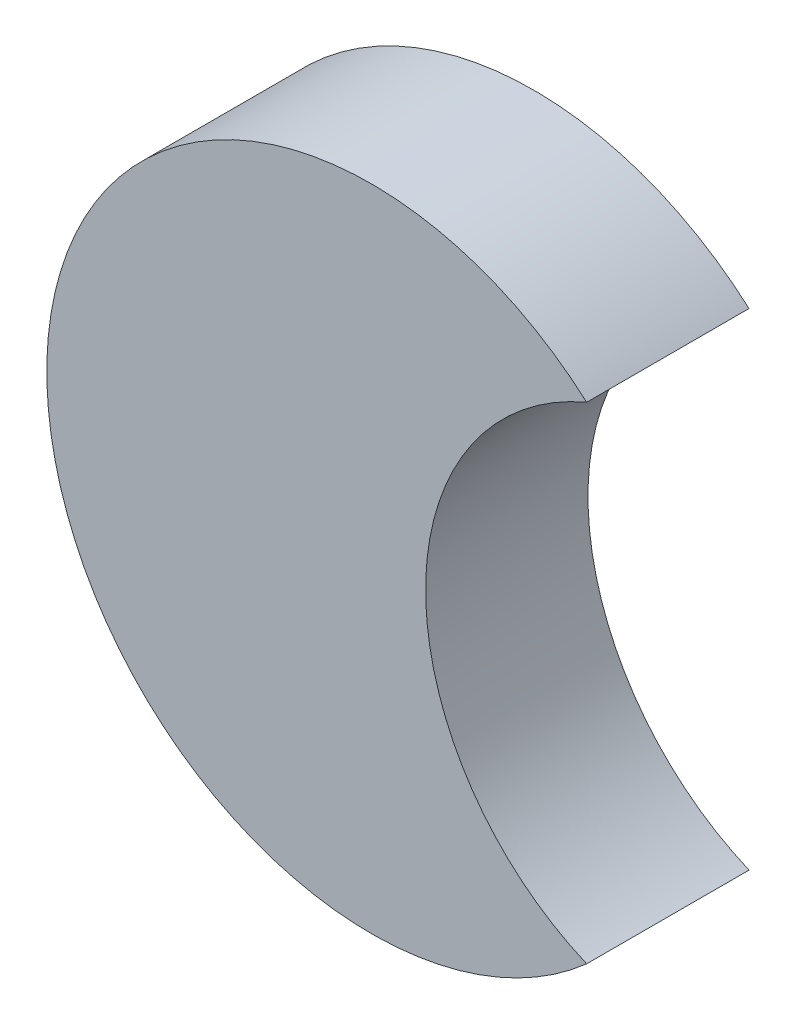
ISO-10303-21;
HEADER;
FILE_DESCRIPTION(('STEP AP214'),'2;1');
FILE_NAME('part.step','',(''),(''),'','','');
FILE_SCHEMA(('AUTOMOTIVE_DESIGN { 1 0 10303 214 1 1 1 1 }'));
ENDSEC;
DATA;
#1=APPLICATION_CONTEXT('core data for automotive mechanical design processes');
#2=APPLICATION_PROTOCOL_DEFINITION('international standard','automotive_design',2000,#1);
#3=PRODUCT_CONTEXT('',#1,'mechanical');
#4=PRODUCT('Part','Part','',(#3));
#5=PRODUCT_RELATED_PRODUCT_CATEGORY('part','',(#4));
#6=PRODUCT_DEFINITION_FORMATION('','',#4);
#7=PRODUCT_DEFINITION_CONTEXT('part definition',#1,'design');
#8=PRODUCT_DEFINITION('design','',#6,#7);
#9=PRODUCT_DEFINITION_SHAPE('','',#8);
#10=(LENGTH_UNIT() NAMED_UNIT(*) SI_UNIT(.MILLI.,.METRE.));
#11=(NAMED_UNIT(*) PLANE_ANGLE_UNIT() SI_UNIT($,.RADIAN.));
#12=(NAMED_UNIT(*) SI_UNIT($,.STERADIAN.) SOLID_ANGLE_UNIT());
#13=UNCERTAINTY_MEASURE_WITH_UNIT(LENGTH_MEASURE(1.E-05),#10,'distance_accuracy_value','');
#14=(GEOMETRIC_REPRESENTATION_CONTEXT(3) GLOBAL_UNCERTAINTY_ASSIGNED_CONTEXT((#13)) GLOBAL_UNIT_ASSIGNED_CONTEXT((#10,
#11,#12)) REPRESENTATION_CONTEXT('',''));
#15=CARTESIAN_POINT('',(0.,0.,0.));
#16=DIRECTION('',(0.,0.,1.));
#17=DIRECTION('',(1.,0.,0.));
#18=AXIS2_PLACEMENT_3D('',#15,#16,#17);
#19=CARTESIAN_POINT('',(0.,0.,30.));
#20=DIRECTION('',(0.,0.,-1.));
#21=DIRECTION('',(-1.,0.,0.));
#22=AXIS2_PLACEMENT_3D('',#19,#20,#21);
#23=CYLINDRICAL_SURFACE('',#22,60.);
#24=CARTESIAN_POINT('',(0.,0.,0.));
#25=DIRECTION('',(0.,0.,1.));
#26=DIRECTION('',(1.,0.,0.));
#27=AXIS2_PLACEMENT_3D('',#24,#25,#26);
#28=CIRCLE('',#27,60.);
#29=CARTESIAN_POINT('',(39.7619047619048,44.9331829465175,0.));
#30=VERTEX_POINT('',#29);
#31=CARTESIAN_POINT('',(39.7619047619048,-44.9331829465175,0.));
#32=VERTEX_POINT('',#31);
#33=EDGE_CURVE('E45',#30,#32,#28,.T.);
#34=ORIENTED_EDGE('',*,*,#33,.T.);
#35=DIRECTION('',(0.,0.,1.));
#36=VECTOR('',#35,1.);
#37=CARTESIAN_POINT('',(39.7619047619048,-44.9331829465175,15.));
#38=LINE('',#37,#36);
#39=CARTESIAN_POINT('',(39.7619047619048,-44.9331829465175,30.));
#40=VERTEX_POINT('',#39);
#41=EDGE_CURVE('E61',#32,#40,#38,.T.);
#42=ORIENTED_EDGE('',*,*,#41,.T.);
#43=CARTESIAN_POINT('',(0.,0.,30.));
#44=DIRECTION('',(0.,0.,1.));
#45=DIRECTION('',(1.,0.,0.));
#46=AXIS2_PLACEMENT_3D('',#43,#44,#45);
#47=CIRCLE('',#46,60.);
#48=CARTESIAN_POINT('',(39.7619047619048,44.9331829465175,30.));
#49=VERTEX_POINT('',#48);
#50=EDGE_CURVE('E11',#49,#40,#47,.T.);
#51=ORIENTED_EDGE('',*,*,#50,.F.);
#52=DIRECTION('',(0.,0.,1.));
#53=VECTOR('',#52,1.);
#54=CARTESIAN_POINT('',(39.7619047619048,44.9331829465175,15.));
#55=LINE('',#54,#53);
#56=EDGE_CURVE('E66',#49,#30,#55,.F.);
#57=ORIENTED_EDGE('',*,*,#56,.T.);
#58=EDGE_LOOP('',(#34,#42,#51,#57));
#59=FACE_BOUND('',#58,.T.);
#60=ADVANCED_FACE('F39',(#59),#23,.T.);
#61=CARTESIAN_POINT('',(0.,0.,30.));
#62=DIRECTION('',(0.,0.,1.));
#63=DIRECTION('',(1.,0.,0.));
#64=AXIS2_PLACEMENT_3D('',#61,#62,#63);
#65=PLANE('',#64);
#66=CARTESIAN_POINT('',(58.8,0.,30.));
#67=DIRECTION('',(0.,0.,1.));
#68=DIRECTION('',(1.,0.,0.));
#69=AXIS2_PLACEMENT_3D('',#66,#67,#68);
#70=CIRCLE('',#69,48.8);
#71=EDGE_CURVE('E59',#49,#40,#70,.T.);
#72=ORIENTED_EDGE('',*,*,#71,.F.);
#73=ORIENTED_EDGE('',*,*,#50,.T.);
#74=EDGE_LOOP('',(#72,#73));
#75=FACE_BOUND('',#74,.T.);
#76=ADVANCED_FACE('F77',(#75),#65,.T.);
#77=CARTESIAN_POINT('',(0.,0.,0.));
#78=DIRECTION('',(0.,0.,1.));
#79=DIRECTION('',(1.,0.,0.));
#80=AXIS2_PLACEMENT_3D('',#77,#78,#79);
#81=PLANE('',#80);
#82=ORIENTED_EDGE('',*,*,#33,.F.);
#83=CARTESIAN_POINT('',(58.8,0.,0.));
#84=DIRECTION('',(0.,0.,1.));
#85=DIRECTION('',(1.,0.,0.));
#86=AXIS2_PLACEMENT_3D('',#83,#84,#85);
#87=CIRCLE('',#86,48.8);
#88=EDGE_CURVE('E52',#30,#32,#87,.T.);
#89=ORIENTED_EDGE('',*,*,#88,.T.);
#90=EDGE_LOOP('',(#82,#89));
#91=FACE_BOUND('',#90,.T.);
#92=ADVANCED_FACE('F75',(#91),#81,.F.);
#93=CARTESIAN_POINT('',(58.8,0.,0.));
#94=DIRECTION('',(0.,0.,1.));
#95=DIRECTION('',(1.,0.,0.));
#96=AXIS2_PLACEMENT_3D('',#93,#94,#95);
#97=CYLINDRICAL_SURFACE('',#96,48.8);
#98=ORIENTED_EDGE('',*,*,#88,.F.);
#99=ORIENTED_EDGE('',*,*,#56,.F.);
#100=ORIENTED_EDGE('',*,*,#71,.T.);
#101=ORIENTED_EDGE('',*,*,#41,.F.);
#102=EDGE_LOOP('',(#98,#99,#100,#101));
#103=FACE_BOUND('',#102,.T.);
#104=ADVANCED_FACE('F62',(#103),#97,.F.);
#105=CLOSED_SHELL('',(#60,#76,#92,#104));
#106=MANIFOLD_SOLID_BREP('B2',#105);
#107=ADVANCED_BREP_SHAPE_REPRESENTATION('',(#18,#106),#14);
#108=SHAPE_DEFINITION_REPRESENTATION(#9,#107);
ENDSEC;
END-ISO-10303-21;
